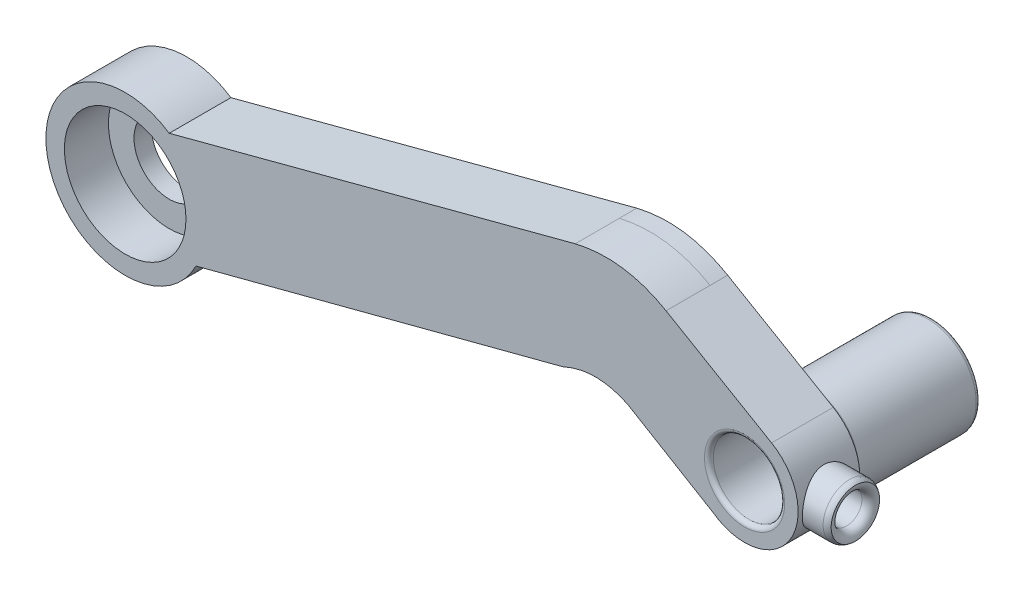
ISO-10303-21;
HEADER;
FILE_DESCRIPTION(('STEP AP214'),'2;1');
FILE_NAME('part.step','',(''),(''),'','','');
FILE_SCHEMA(('AUTOMOTIVE_DESIGN { 1 0 10303 214 1 1 1 1 }'));
ENDSEC;
DATA;
#1=APPLICATION_CONTEXT('core data for automotive mechanical design processes');
#2=APPLICATION_PROTOCOL_DEFINITION('international standard','automotive_design',2000,#1);
#3=PRODUCT_CONTEXT('',#1,'mechanical');
#4=PRODUCT('Part','Part','',(#3));
#5=PRODUCT_RELATED_PRODUCT_CATEGORY('part','',(#4));
#6=PRODUCT_DEFINITION_FORMATION('','',#4);
#7=PRODUCT_DEFINITION_CONTEXT('part definition',#1,'design');
#8=PRODUCT_DEFINITION('design','',#6,#7);
#9=PRODUCT_DEFINITION_SHAPE('','',#8);
#10=(LENGTH_UNIT() NAMED_UNIT(*) SI_UNIT(.MILLI.,.METRE.));
#11=(NAMED_UNIT(*) PLANE_ANGLE_UNIT() SI_UNIT($,.RADIAN.));
#12=(NAMED_UNIT(*) SI_UNIT($,.STERADIAN.) SOLID_ANGLE_UNIT());
#13=UNCERTAINTY_MEASURE_WITH_UNIT(LENGTH_MEASURE(1.E-05),#10,'distance_accuracy_value','');
#14=(GEOMETRIC_REPRESENTATION_CONTEXT(3) GLOBAL_UNCERTAINTY_ASSIGNED_CONTEXT((#13)) GLOBAL_UNIT_ASSIGNED_CONTEXT((#10,
#11,#12)) REPRESENTATION_CONTEXT('',''));
#15=CARTESIAN_POINT('',(0.,0.,0.));
#16=DIRECTION('',(0.,0.,1.));
#17=DIRECTION('',(1.,0.,0.));
#18=AXIS2_PLACEMENT_3D('',#15,#16,#17);
#19=CARTESIAN_POINT('',(-107.093850029804,47.3443372267548,107.431586296032));
#20=DIRECTION('',(0.,0.,1.));
#21=DIRECTION('',(1.,0.,0.));
#22=AXIS2_PLACEMENT_3D('',#19,#20,#21);
#23=PLANE('',#22);
#24=CARTESIAN_POINT('',(-107.093850029804,47.3443372267548,107.431586296032));
#25=DIRECTION('',(0.,0.,1.));
#26=DIRECTION('',(1.,0.,0.));
#27=AXIS2_PLACEMENT_3D('',#24,#25,#26);
#28=CIRCLE('',#27,4.55);
#29=CARTESIAN_POINT('',(-102.543850029804,47.3443372267548,107.431586296032));
#30=VERTEX_POINT('',#29);
#31=EDGE_CURVE('E226',#30,#30,#28,.F.);
#32=ORIENTED_EDGE('',*,*,#31,.T.);
#33=EDGE_LOOP('',(#32));
#34=FACE_BOUND('',#33,.T.);
#35=CARTESIAN_POINT('',(-107.093850029804,47.3443372267548,107.431586296032));
#36=DIRECTION('',(0.,0.,1.));
#37=DIRECTION('',(1.,0.,0.));
#38=AXIS2_PLACEMENT_3D('',#35,#36,#37);
#39=CIRCLE('',#38,6.07839242349853);
#40=CARTESIAN_POINT('',(-110.668111788424,42.4278845080859,107.431586296032));
#41=VERTEX_POINT('',#40);
#42=CARTESIAN_POINT('',(-104.027789288731,52.5927775651886,107.431586296032));
#43=VERTEX_POINT('',#42);
#44=EDGE_CURVE('E323',#41,#43,#39,.T.);
#45=ORIENTED_EDGE('',*,*,#44,.T.);
#46=DIRECTION('',(-0.863458620760315,0.504419676692627,0.));
#47=VECTOR('',#46,1.);
#48=CARTESIAN_POINT('',(-104.027789288731,52.5927775651886,107.431586296032));
#49=LINE('',#48,#47);
#50=CARTESIAN_POINT('',(-116.009751369964,59.5924615036388,107.431586296032));
#51=VERTEX_POINT('',#50);
#52=EDGE_CURVE('E179',#43,#51,#49,.T.);
#53=ORIENTED_EDGE('',*,*,#52,.T.);
#54=CARTESIAN_POINT('',(-186600.66213236,-982410.656727902,107.431586296032));
#55=CARTESIAN_POINT('',(191356.922105133,981558.279573141,107.431586296032));
#56=CARTESIAN_POINT('',(-196594.256959693,-980461.037584645,107.431586296032));
#57=B_SPLINE_CURVE_WITH_KNOTS('',2,(#54,#55,#56),.UNSPECIFIED.,.F.,.F.,(3,3),(0.,1.),.UNSPECIFIED.);
#58=CARTESIAN_POINT('',(-126.318658242328,61.0272416894636,107.431586296032));
#59=VERTEX_POINT('',#58);
#60=EDGE_CURVE('E172',#51,#59,#57,.T.);
#61=ORIENTED_EDGE('',*,*,#60,.T.);
#62=DIRECTION('',(-0.966805766449427,-0.255512445802817,0.));
#63=VECTOR('',#62,1.);
#64=CARTESIAN_POINT('',(-126.318658242328,61.0272416894636,107.431586296032));
#65=LINE('',#64,#63);
#66=CARTESIAN_POINT('',(-172.40389810036,48.8475953114948,107.431586296032));
#67=VERTEX_POINT('',#66);
#68=EDGE_CURVE('E178',#59,#67,#65,.T.);
#69=ORIENTED_EDGE('',*,*,#68,.T.);
#70=CARTESIAN_POINT('',(-177.403833472149,41.3642373568112,107.431586296032));
#71=DIRECTION('',(0.,0.,1.));
#72=DIRECTION('',(1.,0.,0.));
#73=AXIS2_PLACEMENT_3D('',#70,#71,#72);
#74=CIRCLE('',#73,9.00000000000001);
#75=CARTESIAN_POINT('',(-169.366561173002,37.3142677286101,107.431586296032));
#76=VERTEX_POINT('',#75);
#77=EDGE_CURVE('E119',#67,#76,#74,.T.);
#78=ORIENTED_EDGE('',*,*,#77,.T.);
#79=DIRECTION('',(0.967307706535536,0.253605601036256,0.));
#80=VECTOR('',#79,1.);
#81=CARTESIAN_POINT('',(-169.366561173002,37.3142677286101,107.431586296032));
#82=LINE('',#81,#80);
#83=CARTESIAN_POINT('',(-127.716130964861,48.2340425993882,107.431586296032));
#84=VERTEX_POINT('',#83);
#85=EDGE_CURVE('E112',#76,#84,#82,.T.);
#86=ORIENTED_EDGE('',*,*,#85,.T.);
#87=CARTESIAN_POINT('',(-51611.1375174065,-998632.270096202,107.431586296032));
#88=CARTESIAN_POINT('',(47443.000953233,998917.149880823,107.431586296032));
#89=CARTESIAN_POINT('',(-43769.520931614,-999005.692335592,107.431586296032));
#90=B_SPLINE_CURVE_WITH_KNOTS('',2,(#87,#88,#89),.UNSPECIFIED.,.F.,.F.,(3,3),(0.,1.),.UNSPECIFIED.);
#91=CARTESIAN_POINT('',(-120.222972715373,48.1324174911713,107.431586296032));
#92=VERTEX_POINT('',#91);
#93=EDGE_CURVE('E116',#84,#92,#90,.T.);
#94=ORIENTED_EDGE('',*,*,#93,.T.);
#95=DIRECTION('',(0.85861613792559,-0.512619086353352,0.));
#96=VECTOR('',#95,1.);
#97=CARTESIAN_POINT('',(-120.222972715373,48.1324174911713,107.431586296032));
#98=LINE('',#97,#96);
#99=EDGE_CURVE('E60',#92,#41,#98,.T.);
#100=ORIENTED_EDGE('',*,*,#99,.T.);
#101=EDGE_LOOP('',(#45,#53,#61,#69,#78,#86,#94,#100));
#102=FACE_BOUND('',#101,.T.);
#103=CARTESIAN_POINT('',(-177.403833472149,41.3642373568112,107.431586296032));
#104=DIRECTION('',(0.,0.,1.));
#105=DIRECTION('',(1.,0.,0.));
#106=AXIS2_PLACEMENT_3D('',#103,#104,#105);
#107=CIRCLE('',#106,6.89999999999999);
#108=CARTESIAN_POINT('',(-170.503833472149,41.3642373568112,107.431586296032));
#109=VERTEX_POINT('',#108);
#110=EDGE_CURVE('E318',#109,#109,#107,.T.);
#111=ORIENTED_EDGE('',*,*,#110,.F.);
#112=EDGE_LOOP('',(#111));
#113=FACE_BOUND('',#112,.T.);
#114=ADVANCED_FACE('F37',(#34,#102,#113),#23,.T.);
#115=CARTESIAN_POINT('',(-107.093850029804,47.3443372267548,107.431586296032));
#116=DIRECTION('',(0.,0.,-1.));
#117=DIRECTION('',(-1.,0.,0.));
#118=AXIS2_PLACEMENT_3D('',#115,#116,#117);
#119=CYLINDRICAL_SURFACE('',#118,6.07839242349853);
#120=DIRECTION('',(0.,0.,-1.));
#121=VECTOR('',#120,1.);
#122=CARTESIAN_POINT('',(-102.015457606305,44.0041598591593,107.431586296032));
#123=LINE('',#122,#121);
#124=CARTESIAN_POINT('',(-102.015457606305,44.0041598591593,104.597316878061));
#125=VERTEX_POINT('',#124);
#126=CARTESIAN_POINT('',(-102.015457606305,44.0041598591593,103.265855714003));
#127=VERTEX_POINT('',#126);
#128=EDGE_CURVE('E51',#125,#127,#123,.T.);
#129=ORIENTED_EDGE('',*,*,#128,.F.);
#130=CARTESIAN_POINT('',(-101.029639500958,46.9293611842224,100.931586296032));
#131=CARTESIAN_POINT('',(-101.03514837896,46.8488701778565,100.931587324956));
#132=CARTESIAN_POINT('',(-101.042264854202,46.7684737406602,100.934832002595));
#133=CARTESIAN_POINT('',(-101.059620476645,46.608522329393,100.947710205555));
#134=CARTESIAN_POINT('',(-101.069861257932,46.5289678182523,100.957347077248));
#135=CARTESIAN_POINT('',(-101.105090300508,46.2922047582818,100.995678467459));
#136=CARTESIAN_POINT('',(-101.134572872195,46.137072358686,101.033793251388));
#137=CARTESIAN_POINT('',(-101.20316762867,45.8375873693566,101.132862169356));
#138=CARTESIAN_POINT('',(-101.242233928288,45.6931875651807,101.193708175694));
#139=CARTESIAN_POINT('',(-101.327237934188,45.417192408938,101.335927683262));
#140=CARTESIAN_POINT('',(-101.373174299552,45.2855945664047,101.417297180784));
#141=CARTESIAN_POINT('',(-101.472329844249,45.0279101321683,101.605259135258));
#142=CARTESIAN_POINT('',(-101.525836933274,44.9029831338531,101.713288701504));
#143=CARTESIAN_POINT('',(-101.632765596097,44.6723337571731,101.948403481326));
#144=CARTESIAN_POINT('',(-101.68618702545,44.5666312520293,102.07550816883));
#145=CARTESIAN_POINT('',(-101.791806527694,44.3696813095953,102.356918361616));
#146=CARTESIAN_POINT('',(-101.843625678606,44.2800687037756,102.512536859455));
#147=CARTESIAN_POINT('',(-101.911885626921,44.1669091070401,102.758127384239));
#148=CARTESIAN_POINT('',(-101.933062659212,44.1327298166241,102.842028125237));
#149=CARTESIAN_POINT('',(-101.971423698425,44.0718923714042,103.013371777219));
#150=CARTESIAN_POINT('',(-101.988610573199,44.0452288118357,103.100812090785));
#151=CARTESIAN_POINT('',(-102.016764665662,44.0020839033364,103.269846790908));
#152=CARTESIAN_POINT('',(-102.028175121763,43.9848629039182,103.351179125895));
#153=CARTESIAN_POINT('',(-102.046630531779,43.9571987287439,103.515436522181));
#154=CARTESIAN_POINT('',(-102.053678104976,43.9467514861457,103.598360596978));
#155=CARTESIAN_POINT('',(-102.0630936411,43.9328245898158,103.765002408627));
#156=CARTESIAN_POINT('',(-102.065465047672,43.9293398087286,103.848719515783));
#157=CARTESIAN_POINT('',(-102.065437533752,43.9293827921386,104.016122378401));
#158=CARTESIAN_POINT('',(-102.063039146919,43.9329097721389,104.099808136322));
#159=CARTESIAN_POINT('',(-102.050239138091,43.9518304130028,104.324518213254));
#160=CARTESIAN_POINT('',(-102.035420778553,43.973787141592,104.464805801786));
#161=CARTESIAN_POINT('',(-101.994091342886,44.0366663211081,104.739169108793));
#162=CARTESIAN_POINT('',(-101.967575475145,44.0775965444367,104.87324225677));
#163=CARTESIAN_POINT('',(-101.904449297202,44.1787948298536,105.137934016518));
#164=CARTESIAN_POINT('',(-101.867469158891,44.2397880074058,105.268184649224));
#165=CARTESIAN_POINT('',(-101.787425470533,44.3786782468137,105.517267170542));
#166=CARTESIAN_POINT('',(-101.7443591196,44.4565831003483,105.636093759246));
#167=CARTESIAN_POINT('',(-101.648138544164,44.6418080855962,105.879445549291));
#168=CARTESIAN_POINT('',(-101.594488704865,44.7518574551588,106.001705378748));
#169=CARTESIAN_POINT('',(-101.488105785973,44.9907025462812,106.226923362917));
#170=CARTESIAN_POINT('',(-101.435373373809,45.119511325256,106.329867958183));
#171=CARTESIAN_POINT('',(-101.331271078114,45.4041872145856,106.521066639427));
#172=CARTESIAN_POINT('',(-101.280309820244,45.5613671498089,106.607608050246));
#173=CARTESIAN_POINT('',(-101.189216115857,45.8912892022293,106.752003973535));
#174=CARTESIAN_POINT('',(-101.14907537686,46.064019266123,106.809880482471));
#175=CARTESIAN_POINT('',(-101.086113647202,46.4053963749256,106.890247224182));
#176=CARTESIAN_POINT('',(-101.06215525563,46.573245570073,106.915218884505));
#177=CARTESIAN_POINT('',(-101.028459093046,46.9121270884989,106.936326613966));
#178=CARTESIAN_POINT('',(-101.018711666662,47.0831571704956,106.932482272508));
#179=CARTESIAN_POINT('',(-101.013837418185,47.4055560328334,106.89754736327));
#180=CARTESIAN_POINT('',(-101.017370268294,47.5572078219119,106.869166320528));
#181=CARTESIAN_POINT('',(-101.035022805788,47.8537838656488,106.789734005047));
#182=CARTESIAN_POINT('',(-101.049142822067,47.9987079111593,106.73868202805));
#183=CARTESIAN_POINT('',(-101.086054928131,48.278867648582,106.615314732286));
#184=CARTESIAN_POINT('',(-101.10889190893,48.4140488084345,106.542889791629));
#185=CARTESIAN_POINT('',(-101.160561971437,48.6710450253328,106.378990855084));
#186=CARTESIAN_POINT('',(-101.189397182707,48.7928553117657,106.287510093758));
#187=CARTESIAN_POINT('',(-101.252548720017,49.0302684226731,106.079402894734));
#188=CARTESIAN_POINT('',(-101.287120905531,49.1445326975329,105.961325588729));
#189=CARTESIAN_POINT('',(-101.355694299152,49.3524289752452,105.707991531997));
#190=CARTESIAN_POINT('',(-101.389695207125,49.4460504278885,105.572726052085));
#191=CARTESIAN_POINT('',(-101.454510225301,49.6144164128436,105.280750651648));
#192=CARTESIAN_POINT('',(-101.485083401786,49.6879976720877,105.12331081739));
#193=CARTESIAN_POINT('',(-101.536369083653,49.8071654000785,104.796688522582));
#194=CARTESIAN_POINT('',(-101.557089185172,49.8527734424065,104.627515223516));
#195=CARTESIAN_POINT('',(-101.584290560656,49.9119455649083,104.293639846149));
#196=CARTESIAN_POINT('',(-101.591590735547,49.927356652712,104.129333483464));
#197=CARTESIAN_POINT('',(-101.593298888728,49.930996739837,103.800379229532));
#198=CARTESIAN_POINT('',(-101.587711000933,49.919234455161,103.635731464717));
#199=CARTESIAN_POINT('',(-101.565356556279,49.8708430588426,103.322376258889));
#200=CARTESIAN_POINT('',(-101.549365256595,49.8359354910232,103.173340538804));
#201=CARTESIAN_POINT('',(-101.509119903712,49.7443637991683,102.883300144777));
#202=CARTESIAN_POINT('',(-101.484863464174,49.6876933910933,102.742297803997));
#203=CARTESIAN_POINT('',(-101.42959948646,49.5508771610394,102.464317905793));
#204=CARTESIAN_POINT('',(-101.398309591107,49.4696767641473,102.327917292507));
#205=CARTESIAN_POINT('',(-101.333488663575,49.2871338275567,102.069893591578));
#206=CARTESIAN_POINT('',(-101.299956691679,49.1857828065968,101.948276761178));
#207=CARTESIAN_POINT('',(-101.231701857401,48.9560352407744,101.713079990934));
#208=CARTESIAN_POINT('',(-101.197102682948,48.826112604957,101.600949927174));
#209=CARTESIAN_POINT('',(-101.134098320088,48.5478640486654,101.39981716196));
#210=CARTESIAN_POINT('',(-101.105694792129,48.3995332114204,101.310820659133));
#211=CARTESIAN_POINT('',(-101.071018808127,48.1679529046836,101.197887263987));
#212=CARTESIAN_POINT('',(-101.060843232217,48.0900419120073,101.163902800728));
#213=CARTESIAN_POINT('',(-101.043343867949,47.9313487127396,101.102586306718));
#214=CARTESIAN_POINT('',(-101.036018686361,47.8505679299847,101.075251028398));
#215=CARTESIAN_POINT('',(-101.024567098357,47.686939362868,101.027567304449));
#216=CARTESIAN_POINT('',(-101.020433960593,47.6040963105819,101.00720420675));
#217=CARTESIAN_POINT('',(-101.015588218602,47.436916781823,100.973605879329));
#218=CARTESIAN_POINT('',(-101.014873553637,47.3525812358486,100.960366359616));
#219=CARTESIAN_POINT('',(-101.01664556465,47.2116411499363,100.94435947308));
#220=CARTESIAN_POINT('',(-101.018136885435,47.1552442607092,100.939567927675));
#221=CARTESIAN_POINT('',(-101.022701655192,47.042336459454,100.933181055204));
#222=CARTESIAN_POINT('',(-101.025775027976,46.9858255530471,100.931585574242));
#223=CARTESIAN_POINT('',(-101.029639500958,46.9293611842224,100.931586296032));
#224=B_SPLINE_CURVE_WITH_KNOTS('',3,(#130,#131,#132,#133,#134,#135,#136,#137,#138,#139,#140,
#141,#142,#143,#144,#145,#146,#147,#148,#149,#150,#151,#152,#153,#154,#155,#156,#157,#158,#159,
#160,#161,#162,#163,#164,#165,#166,#167,#168,#169,#170,#171,#172,#173,#174,#175,#176,#177,#178,
#179,#180,#181,#182,#183,#184,#185,#186,#187,#188,#189,#190,#191,#192,#193,#194,#195,#196,#197,
#198,#199,#200,#201,#202,#203,#204,#205,#206,#207,#208,#209,#210,#211,#212,#213,#214,#215,#216,
#217,#218,#219,#220,#221,#222,#223),.UNSPECIFIED.,.T.,.F.,(4,2,2,2,2,2,2,2,2,2,2,2,2,2,2,2,2,2,
2,2,2,2,2,2,2,2,2,2,2,2,2,2,2,2,2,2,2,2,2,2,2,2,2,2,2,2,4),(0.,0.241976151992528,
0.484079080770245,0.968805991864989,1.45125592348759,1.93361181184639,2.45225908842233,
2.97143950377482,3.52880308968135,3.80754748181999,4.08609090695529,4.33745647265872,
4.58867098289715,4.83970042330999,5.0907017793762,5.51684725497591,5.94316745351604,
6.38699526891318,6.83102800375372,7.34793525150434,7.86520402552325,8.42181230521929,
8.97799279843693,9.48923238397878,10.0001244553084,10.4609039663731,10.9216977922767,
11.3848973694326,11.8482616786934,12.3498070684413,12.8516081987275,13.3782390269967,
13.9044631932075,14.397349899487,14.8900785317039,15.3497446794628,15.809543656152,
16.2929153552599,16.7764909345854,17.2992528678341,17.8221547308242,18.0786855237172,
18.3350907701147,18.590953824079,18.8466626181231,19.0164168460133,19.186162899762),.UNSPECIFIED.);
#225=EDGE_CURVE('E242',#125,#127,#224,.T.);
#226=ORIENTED_EDGE('',*,*,#225,.T.);
#227=EDGE_LOOP('',(#129,#226));
#228=FACE_BOUND('',#227,.T.);
#229=DIRECTION('',(0.,0.,-1.));
#230=VECTOR('',#229,1.);
#231=CARTESIAN_POINT('',(-110.668111788424,42.4278845080859,107.431586296032));
#232=LINE('',#231,#230);
#233=CARTESIAN_POINT('',(-110.668111788424,42.4278845080859,100.431586296032));
#234=VERTEX_POINT('',#233);
#235=EDGE_CURVE('E139',#41,#234,#232,.T.);
#236=ORIENTED_EDGE('',*,*,#235,.T.);
#237=CARTESIAN_POINT('',(-107.093850029804,47.3443372267548,100.431586296032));
#238=DIRECTION('',(0.,0.,-1.));
#239=DIRECTION('',(-1.,0.,0.));
#240=AXIS2_PLACEMENT_3D('',#237,#238,#239);
#241=CIRCLE('',#240,6.07839242349853);
#242=CARTESIAN_POINT('',(-104.027789288731,52.5927775651886,100.431586296032));
#243=VERTEX_POINT('',#242);
#244=EDGE_CURVE('E347',#243,#234,#241,.T.);
#245=ORIENTED_EDGE('',*,*,#244,.F.);
#246=DIRECTION('',(0.,0.,-1.));
#247=VECTOR('',#246,1.);
#248=CARTESIAN_POINT('',(-104.027789288731,52.5927775651886,107.431586296032));
#249=LINE('',#248,#247);
#250=EDGE_CURVE('E82',#43,#243,#249,.T.);
#251=ORIENTED_EDGE('',*,*,#250,.F.);
#252=ORIENTED_EDGE('',*,*,#44,.F.);
#253=EDGE_LOOP('',(#236,#245,#251,#252));
#254=FACE_BOUND('',#253,.T.);
#255=ADVANCED_FACE('F249',(#228,#254),#119,.T.);
#256=CARTESIAN_POINT('',(-104.027789288731,52.5927775651886,107.431586296032));
#257=DIRECTION('',(-0.504419676692627,-0.863458620760315,0.));
#258=DIRECTION('',(0.863458620760315,-0.504419676692627,0.));
#259=AXIS2_PLACEMENT_3D('',#256,#257,#258);
#260=PLANE('',#259);
#261=ORIENTED_EDGE('',*,*,#250,.T.);
#262=DIRECTION('',(0.863458620758999,-0.504419676694879,0.));
#263=VECTOR('',#262,1.);
#264=CARTESIAN_POINT('',(-116.009751369881,59.5924615035235,100.431586296032));
#265=LINE('',#264,#263);
#266=CARTESIAN_POINT('',(-116.009751369881,59.5924615035235,100.431586296032));
#267=VERTEX_POINT('',#266);
#268=EDGE_CURVE('E305',#267,#243,#265,.T.);
#269=ORIENTED_EDGE('',*,*,#268,.F.);
#270=DIRECTION('',(0.,0.,1.));
#271=VECTOR('',#270,1.);
#272=CARTESIAN_POINT('',(-116.009751369881,59.5924615035235,100.431586296032));
#273=LINE('',#272,#271);
#274=CARTESIAN_POINT('',(-116.009751369964,59.5924615036388,102.431586296032));
#275=VERTEX_POINT('',#274);
#276=EDGE_CURVE('E73',#267,#275,#273,.T.);
#277=ORIENTED_EDGE('',*,*,#276,.T.);
#278=DIRECTION('',(0.,0.,-1.));
#279=VECTOR('',#278,1.);
#280=CARTESIAN_POINT('',(-116.009751369964,59.5924615036388,107.431586296032));
#281=LINE('',#280,#279);
#282=EDGE_CURVE('E207',#51,#275,#281,.T.);
#283=ORIENTED_EDGE('',*,*,#282,.F.);
#284=ORIENTED_EDGE('',*,*,#52,.F.);
#285=EDGE_LOOP('',(#261,#269,#277,#283,#284));
#286=FACE_BOUND('',#285,.T.);
#287=ADVANCED_FACE('F169',(#286),#260,.F.);
#288=DIRECTION('',(0.,0.,-1.));
#289=VECTOR('',#288,1.);
#290=SURFACE_OF_LINEAR_EXTRUSION('',#57,#289);
#291=CARTESIAN_POINT('',(-186600.66213236,-982410.656727902,102.431586296032));
#292=CARTESIAN_POINT('',(191356.922105133,981558.279573141,102.431586296032));
#293=CARTESIAN_POINT('',(-196594.256959693,-980461.037584645,102.431586296032));
#294=B_SPLINE_CURVE_WITH_KNOTS('',2,(#291,#292,#293),.UNSPECIFIED.,.F.,.F.,(3,3),(0.,1.),.UNSPECIFIED.);
#295=CARTESIAN_POINT('',(-126.318658237721,61.0272416906097,102.431586296032));
#296=VERTEX_POINT('',#295);
#297=EDGE_CURVE('E321',#275,#296,#294,.T.);
#298=ORIENTED_EDGE('',*,*,#297,.T.);
#299=DIRECTION('',(0.,0.,-1.));
#300=VECTOR('',#299,1.);
#301=CARTESIAN_POINT('',(-126.318658242328,61.0272416894636,107.431586296032));
#302=LINE('',#301,#300);
#303=EDGE_CURVE('E198',#59,#296,#302,.T.);
#304=ORIENTED_EDGE('',*,*,#303,.F.);
#305=ORIENTED_EDGE('',*,*,#60,.F.);
#306=ORIENTED_EDGE('',*,*,#282,.T.);
#307=EDGE_LOOP('',(#298,#304,#305,#306));
#308=FACE_BOUND('',#307,.T.);
#309=ADVANCED_FACE('F164',(#308),#290,.F.);
#310=CARTESIAN_POINT('',(-126.318658242328,61.0272416894636,107.431586296032));
#311=DIRECTION('',(0.255512445802817,-0.966805766449427,0.));
#312=DIRECTION('',(0.966805766449427,0.255512445802817,0.));
#313=AXIS2_PLACEMENT_3D('',#310,#311,#312);
#314=PLANE('',#313);
#315=ORIENTED_EDGE('',*,*,#303,.T.);
#316=DIRECTION('',(0.,0.,1.));
#317=VECTOR('',#316,1.);
#318=CARTESIAN_POINT('',(-126.318658237721,61.0272416906097,100.431586296032));
#319=LINE('',#318,#317);
#320=CARTESIAN_POINT('',(-126.318658237721,61.0272416906097,100.431586296032));
#321=VERTEX_POINT('',#320);
#322=EDGE_CURVE('E312',#321,#296,#319,.T.);
#323=ORIENTED_EDGE('',*,*,#322,.F.);
#324=DIRECTION('',(0.966805766449426,0.255512445802817,0.));
#325=VECTOR('',#324,1.);
#326=CARTESIAN_POINT('',(-172.40389810036,48.8475953114948,100.431586296032));
#327=LINE('',#326,#325);
#328=CARTESIAN_POINT('',(-172.40389810036,48.8475953114948,100.431586296032));
#329=VERTEX_POINT('',#328);
#330=EDGE_CURVE('E195',#329,#321,#327,.T.);
#331=ORIENTED_EDGE('',*,*,#330,.F.);
#332=DIRECTION('',(0.,0.,-1.));
#333=VECTOR('',#332,1.);
#334=CARTESIAN_POINT('',(-172.40389810036,48.8475953114948,107.431586296032));
#335=LINE('',#334,#333);
#336=EDGE_CURVE('E191',#67,#329,#335,.T.);
#337=ORIENTED_EDGE('',*,*,#336,.F.);
#338=ORIENTED_EDGE('',*,*,#68,.F.);
#339=EDGE_LOOP('',(#315,#323,#331,#337,#338));
#340=FACE_BOUND('',#339,.T.);
#341=ADVANCED_FACE('F160',(#340),#314,.F.);
#342=CARTESIAN_POINT('',(-177.403833472149,41.3642373568112,107.431586296032));
#343=DIRECTION('',(0.,0.,-1.));
#344=DIRECTION('',(-1.,0.,0.));
#345=AXIS2_PLACEMENT_3D('',#342,#343,#344);
#346=CYLINDRICAL_SURFACE('',#345,9.00000000000001);
#347=ORIENTED_EDGE('',*,*,#336,.T.);
#348=CARTESIAN_POINT('',(-177.403833472149,41.3642373568112,100.431586296032));
#349=DIRECTION('',(0.,0.,-1.));
#350=DIRECTION('',(-1.,0.,0.));
#351=AXIS2_PLACEMENT_3D('',#348,#349,#350);
#352=CIRCLE('',#351,9.);
#353=CARTESIAN_POINT('',(-169.366561173002,37.3142677286101,100.431586296032));
#354=VERTEX_POINT('',#353);
#355=EDGE_CURVE('E201',#354,#329,#352,.T.);
#356=ORIENTED_EDGE('',*,*,#355,.F.);
#357=DIRECTION('',(0.,0.,-1.));
#358=VECTOR('',#357,1.);
#359=CARTESIAN_POINT('',(-169.366561173002,37.3142677286101,107.431586296032));
#360=LINE('',#359,#358);
#361=EDGE_CURVE('E133',#76,#354,#360,.T.);
#362=ORIENTED_EDGE('',*,*,#361,.F.);
#363=ORIENTED_EDGE('',*,*,#77,.F.);
#364=EDGE_LOOP('',(#347,#356,#362,#363));
#365=FACE_BOUND('',#364,.T.);
#366=ADVANCED_FACE('F157',(#365),#346,.T.);
#367=CARTESIAN_POINT('',(-169.366561173002,37.3142677286101,107.431586296032));
#368=DIRECTION('',(-0.253605601036256,0.967307706535536,0.));
#369=DIRECTION('',(-0.967307706535536,-0.253605601036256,0.));
#370=AXIS2_PLACEMENT_3D('',#367,#368,#369);
#371=PLANE('',#370);
#372=ORIENTED_EDGE('',*,*,#361,.T.);
#373=DIRECTION('',(-0.967307706507298,-0.253605601143964,0.));
#374=VECTOR('',#373,1.);
#375=CARTESIAN_POINT('',(-127.716130938146,48.2340426115734,100.431586296032));
#376=LINE('',#375,#374);
#377=CARTESIAN_POINT('',(-127.716130938146,48.2340426115734,100.431586296032));
#378=VERTEX_POINT('',#377);
#379=EDGE_CURVE('E362',#378,#354,#376,.T.);
#380=ORIENTED_EDGE('',*,*,#379,.F.);
#381=DIRECTION('',(0.,0.,1.));
#382=VECTOR('',#381,1.);
#383=CARTESIAN_POINT('',(-127.716130938146,48.2340426115734,100.431586296032));
#384=LINE('',#383,#382);
#385=CARTESIAN_POINT('',(-127.716130938146,48.2340426115734,102.431586296032));
#386=VERTEX_POINT('',#385);
#387=EDGE_CURVE('E130',#378,#386,#384,.T.);
#388=ORIENTED_EDGE('',*,*,#387,.T.);
#389=DIRECTION('',(0.,0.,-1.));
#390=VECTOR('',#389,1.);
#391=CARTESIAN_POINT('',(-127.716130964861,48.2340425993882,107.431586296032));
#392=LINE('',#391,#390);
#393=EDGE_CURVE('E126',#84,#386,#392,.T.);
#394=ORIENTED_EDGE('',*,*,#393,.F.);
#395=ORIENTED_EDGE('',*,*,#85,.F.);
#396=EDGE_LOOP('',(#372,#380,#388,#394,#395));
#397=FACE_BOUND('',#396,.T.);
#398=ADVANCED_FACE('F127',(#397),#371,.F.);
#399=DIRECTION('',(0.,0.,-1.));
#400=VECTOR('',#399,1.);
#401=SURFACE_OF_LINEAR_EXTRUSION('',#90,#400);
#402=CARTESIAN_POINT('',(-51611.1375174065,-998632.270096202,102.431586296032));
#403=CARTESIAN_POINT('',(47443.000953233,998917.149880823,102.431586296032));
#404=CARTESIAN_POINT('',(-43769.520931614,-999005.692335592,102.431586296032));
#405=B_SPLINE_CURVE_WITH_KNOTS('',2,(#402,#403,#404),.UNSPECIFIED.,.F.,.F.,(3,3),(0.,1.),.UNSPECIFIED.);
#406=CARTESIAN_POINT('',(-120.222972708589,48.1324174876799,102.431586296032));
#407=VERTEX_POINT('',#406);
#408=EDGE_CURVE('E324',#386,#407,#405,.T.);
#409=ORIENTED_EDGE('',*,*,#408,.T.);
#410=DIRECTION('',(0.,0.,-1.));
#411=VECTOR('',#410,1.);
#412=CARTESIAN_POINT('',(-120.222972715373,48.1324174911713,107.431586296032));
#413=LINE('',#412,#411);
#414=EDGE_CURVE('E134',#92,#407,#413,.T.);
#415=ORIENTED_EDGE('',*,*,#414,.F.);
#416=ORIENTED_EDGE('',*,*,#93,.F.);
#417=ORIENTED_EDGE('',*,*,#393,.T.);
#418=EDGE_LOOP('',(#409,#415,#416,#417));
#419=FACE_BOUND('',#418,.T.);
#420=ADVANCED_FACE('F136',(#419),#401,.F.);
#421=CARTESIAN_POINT('',(-120.222972715373,48.1324174911713,107.431586296032));
#422=DIRECTION('',(0.512619086353352,0.85861613792559,0.));
#423=DIRECTION('',(-0.85861613792559,0.512619086353352,0.));
#424=AXIS2_PLACEMENT_3D('',#421,#422,#423);
#425=PLANE('',#424);
#426=ORIENTED_EDGE('',*,*,#414,.T.);
#427=DIRECTION('',(0.,0.,1.));
#428=VECTOR('',#427,1.);
#429=CARTESIAN_POINT('',(-120.222972708589,48.1324174876799,100.431586296032));
#430=LINE('',#429,#428);
#431=CARTESIAN_POINT('',(-120.222972708589,48.1324174876799,100.431586296032));
#432=VERTEX_POINT('',#431);
#433=EDGE_CURVE('E315',#432,#407,#430,.T.);
#434=ORIENTED_EDGE('',*,*,#433,.F.);
#435=DIRECTION('',(-0.858616137925589,0.512619086353353,0.));
#436=VECTOR('',#435,1.);
#437=CARTESIAN_POINT('',(-110.668111788424,42.4278845080859,100.431586296032));
#438=LINE('',#437,#436);
#439=EDGE_CURVE('E343',#234,#432,#438,.T.);
#440=ORIENTED_EDGE('',*,*,#439,.F.);
#441=ORIENTED_EDGE('',*,*,#235,.F.);
#442=ORIENTED_EDGE('',*,*,#99,.F.);
#443=EDGE_LOOP('',(#426,#434,#440,#441,#442));
#444=FACE_BOUND('',#443,.T.);
#445=ADVANCED_FACE('F153',(#444),#425,.F.);
#446=CARTESIAN_POINT('',(-107.093850029804,47.3443372267548,107.431586296032));
#447=DIRECTION('',(0.,0.,-1.));
#448=DIRECTION('',(-1.,0.,0.));
#449=AXIS2_PLACEMENT_3D('',#446,#447,#448);
#450=CYLINDRICAL_SURFACE('',#449,4.05);
#451=CARTESIAN_POINT('',(-103.06516601587,46.9293611842224,102.181586296032));
#452=CARTESIAN_POINT('',(-103.075060000896,46.833385201861,102.181596397625));
#453=CARTESIAN_POINT('',(-103.088425255544,46.737607208956,102.189530322442));
#454=CARTESIAN_POINT('',(-103.121451807033,46.5495179045129,102.220632446272));
#455=CARTESIAN_POINT('',(-103.141131325367,46.457217500611,102.243844942051));
#456=CARTESIAN_POINT('',(-103.185388680086,46.2790614079683,102.30419252342));
#457=CARTESIAN_POINT('',(-103.209943504901,46.1931779573536,102.341262898907));
#458=CARTESIAN_POINT('',(-103.262353759853,46.0292119002682,102.427977582026));
#459=CARTESIAN_POINT('',(-103.290208046734,45.9511266089416,102.477617541075));
#460=CARTESIAN_POINT('',(-103.349339302732,45.7989392980635,102.592061085546));
#461=CARTESIAN_POINT('',(-103.380719714251,45.7254876295163,102.657676726633));
#462=CARTESIAN_POINT('',(-103.442605732052,45.5903561757495,102.800549166119));
#463=CARTESIAN_POINT('',(-103.473110574908,45.5286864134097,102.877815776923));
#464=CARTESIAN_POINT('',(-103.531685723101,45.4162063067227,103.046383772149));
#465=CARTESIAN_POINT('',(-103.55958331292,45.366013915248,103.138162146698));
#466=CARTESIAN_POINT('',(-103.607725274785,45.282350709972,103.330878724293));
#467=CARTESIAN_POINT('',(-103.627980287816,45.248856625577,103.431803947113));
#468=CARTESIAN_POINT('',(-103.65604962178,45.203151052788,103.628609320317));
#469=CARTESIAN_POINT('',(-103.664953278484,45.1890630686814,103.723893842979));
#470=CARTESIAN_POINT('',(-103.672689856065,45.1767974746488,103.915859181916));
#471=CARTESIAN_POINT('',(-103.671531086383,45.1786067369648,104.012538780291));
#472=CARTESIAN_POINT('',(-103.660127196025,45.1967511983491,104.191675705467));
#473=CARTESIAN_POINT('',(-103.651031951744,45.2112488127667,104.274404448435));
#474=CARTESIAN_POINT('',(-103.626373273105,45.2515736202893,104.436036477937));
#475=CARTESIAN_POINT('',(-103.610807831078,45.2774043301313,104.51493856859));
#476=CARTESIAN_POINT('',(-103.573923328844,45.3408366649547,104.670843326376));
#477=CARTESIAN_POINT('',(-103.552372004127,45.3789262563986,104.747590528664));
#478=CARTESIAN_POINT('',(-103.505809408357,45.4652763401189,104.893971939722));
#479=CARTESIAN_POINT('',(-103.480796487256,45.5135416886741,104.963602728611));
#480=CARTESIAN_POINT('',(-103.425402715228,45.6269197117785,105.104384195893));
#481=CARTESIAN_POINT('',(-103.394769640547,45.6934608151147,105.174289002026));
#482=CARTESIAN_POINT('',(-103.333900010131,45.8372292545269,105.30236127743));
#483=CARTESIAN_POINT('',(-103.303663697996,45.9144628475392,105.360521824948));
#484=CARTESIAN_POINT('',(-103.243892183749,46.0838156782771,105.467240318717));
#485=CARTESIAN_POINT('',(-103.214545748655,46.176591168556,105.514871704494));
#486=CARTESIAN_POINT('',(-103.161392586391,46.3705000419401,105.593239057506));
#487=CARTESIAN_POINT('',(-103.137582610018,46.4716284754497,105.623984948902));
#488=CARTESIAN_POINT('',(-103.098781513035,46.6722785914793,105.665423075762));
#489=CARTESIAN_POINT('',(-103.083307933546,46.7714571785988,105.677316583271));
#490=CARTESIAN_POINT('',(-103.059820021056,46.9712470477762,105.683932595972));
#491=CARTESIAN_POINT('',(-103.0518012783,47.0718574470652,105.678665260624));
#492=CARTESIAN_POINT('',(-103.043652215459,47.2623954086759,105.652063129381));
#493=CARTESIAN_POINT('',(-103.04290376026,47.3524985574039,105.632146582756));
#494=CARTESIAN_POINT('',(-103.04707577603,47.5283277319699,105.578458394707));
#495=CARTESIAN_POINT('',(-103.051996257455,47.6140537497329,105.544686727724));
#496=CARTESIAN_POINT('',(-103.066363818616,47.7787174401787,105.464387041297));
#497=CARTESIAN_POINT('',(-103.075804746055,47.8576641677121,105.417876396229));
#498=CARTESIAN_POINT('',(-103.097729175016,48.0070804833983,105.313374752078));
#499=CARTESIAN_POINT('',(-103.110213586337,48.0775475272654,105.255380321084));
#500=CARTESIAN_POINT('',(-103.137351062643,48.2124596366466,105.125506344674));
#501=CARTESIAN_POINT('',(-103.152089520721,48.2762849640318,105.053000215607));
#502=CARTESIAN_POINT('',(-103.181043351678,48.3912210402981,104.898409548905));
#503=CARTESIAN_POINT('',(-103.19525858798,48.4423284891877,104.816322533355));
#504=CARTESIAN_POINT('',(-103.221570027927,48.5318567866331,104.641810777708));
#505=CARTESIAN_POINT('',(-103.233585705177,48.5698290279366,104.549142413844));
#506=CARTESIAN_POINT('',(-103.253032538144,48.6294905312969,104.358257364552));
#507=CARTESIAN_POINT('',(-103.260465674564,48.6511868291573,104.260043096286));
#508=CARTESIAN_POINT('',(-103.269330140697,48.6769009687988,104.065212565834));
#509=CARTESIAN_POINT('',(-103.270997552566,48.6816145365796,103.968698903467));
#510=CARTESIAN_POINT('',(-103.268728972522,48.6751117933448,103.776286184741));
#511=CARTESIAN_POINT('',(-103.264793694734,48.6638975125096,103.680387051617));
#512=CARTESIAN_POINT('',(-103.252150185387,48.6266033717303,103.495104433136));
#513=CARTESIAN_POINT('',(-103.243599302971,48.601012507656,103.405610605054));
#514=CARTESIAN_POINT('',(-103.223039821252,48.5361753792065,103.232138041228));
#515=CARTESIAN_POINT('',(-103.211030351184,48.4969256754376,103.148160700914));
#516=CARTESIAN_POINT('',(-103.18464181636,48.404056217139,102.984500357986));
#517=CARTESIAN_POINT('',(-103.170188244594,48.3499328908296,102.905115293881));
#518=CARTESIAN_POINT('',(-103.141267481667,48.2294491550126,102.756237387114));
#519=CARTESIAN_POINT('',(-103.126800288501,48.1630865115281,102.686746354466));
#520=CARTESIAN_POINT('',(-103.099377386541,48.0169524677041,102.556979385341));
#521=CARTESIAN_POINT('',(-103.08649853676,47.9367721014224,102.49714581356));
#522=CARTESIAN_POINT('',(-103.065048640461,47.7669131120698,102.391785346426));
#523=CARTESIAN_POINT('',(-103.056478563387,47.6772323569687,102.346261671562));
#524=CARTESIAN_POINT('',(-103.045634476962,47.4944467391515,102.272506935571));
#525=CARTESIAN_POINT('',(-103.043144042948,47.4015828920825,102.243710185073));
#526=CARTESIAN_POINT('',(-103.044898601592,47.2125927550954,102.201964700174));
#527=CARTESIAN_POINT('',(-103.04912440174,47.1164765268892,102.188970993689));
#528=CARTESIAN_POINT('',(-103.059259283395,46.9900417170233,102.182371255469));
#529=CARTESIAN_POINT('',(-103.062039313573,46.9596915641214,102.181583103721));
#530=CARTESIAN_POINT('',(-103.06516601587,46.9293611842224,102.181586296032));
#531=B_SPLINE_CURVE_WITH_KNOTS('',3,(#451,#452,#453,#454,#455,#456,#457,#458,#459,#460,#461,
#462,#463,#464,#465,#466,#467,#468,#469,#470,#471,#472,#473,#474,#475,#476,#477,#478,#479,#480,
#481,#482,#483,#484,#485,#486,#487,#488,#489,#490,#491,#492,#493,#494,#495,#496,#497,#498,#499,
#500,#501,#502,#503,#504,#505,#506,#507,#508,#509,#510,#511,#512,#513,#514,#515,#516,#517,#518,
#519,#520,#521,#522,#523,#524,#525,#526,#527,#528,#529,#530),.UNSPECIFIED.,.T.,.F.,(4,2,2,2,2,2,
2,2,2,2,2,2,2,2,2,2,2,2,2,2,2,2,2,2,2,2,2,2,2,2,2,2,2,2,2,2,2,2,2,4),(0.,0.289367616406886,
0.579577906348445,0.868449636056355,1.15722156370922,1.46599185550348,1.77502366015392,
2.09804463320174,2.42061418025226,2.70906228205944,2.99727220923774,3.24957957278893,
3.50196528447339,3.76599197096975,4.03014494795871,4.33263218845503,4.63529718986813,
4.95862369244483,5.2817599614911,5.58333335245215,5.88472824016857,6.16024773126495,
6.43576773061875,6.710913810397,6.98614224158335,7.27797430672869,7.56988201668414,
7.87095302291488,8.17189380633962,8.46035622674998,8.74878188273691,9.02794434743848,
9.30717715817405,9.59737020077427,9.88761626326801,10.1887279745772,10.48990740361,
10.7801980616331,11.0696606668322,11.1611067715776),.UNSPECIFIED.);
#532=CARTESIAN_POINT('',(-103.06516601587,46.9293611842224,102.181586296032));
#533=VERTEX_POINT('',#532);
#534=EDGE_CURVE('E382',#533,#533,#531,.T.);
#535=ORIENTED_EDGE('',*,*,#534,.F.);
#536=EDGE_LOOP('',(#535));
#537=FACE_BOUND('',#536,.T.);
#538=CARTESIAN_POINT('',(-107.093850029804,47.3443372267548,106.931586296032));
#539=DIRECTION('',(0.,0.,1.));
#540=DIRECTION('',(1.,0.,0.));
#541=AXIS2_PLACEMENT_3D('',#538,#539,#540);
#542=CIRCLE('',#541,4.05);
#543=CARTESIAN_POINT('',(-103.043850029804,47.3443372267548,106.931586296032));
#544=VERTEX_POINT('',#543);
#545=EDGE_CURVE('E223',#544,#544,#542,.T.);
#546=ORIENTED_EDGE('',*,*,#545,.T.);
#547=EDGE_LOOP('',(#546));
#548=FACE_BOUND('',#547,.T.);
#549=CARTESIAN_POINT('',(-107.093850029776,47.3443372266827,89.1315862960318));
#550=DIRECTION('',(0.,0.,-1.));
#551=DIRECTION('',(-1.,0.,0.));
#552=AXIS2_PLACEMENT_3D('',#549,#550,#551);
#553=CIRCLE('',#552,4.05);
#554=CARTESIAN_POINT('',(-111.143850029776,47.3443372266827,89.1315862960318));
#555=VERTEX_POINT('',#554);
#556=EDGE_CURVE('E410',#555,#555,#553,.T.);
#557=ORIENTED_EDGE('',*,*,#556,.T.);
#558=EDGE_LOOP('',(#557));
#559=FACE_BOUND('',#558,.T.);
#560=ADVANCED_FACE('F377',(#537,#548,#559),#450,.F.);
#561=CARTESIAN_POINT('',(-177.403833472149,41.3642373568112,107.431586296032));
#562=DIRECTION('',(0.,0.,-1.));
#563=DIRECTION('',(-1.,0.,0.));
#564=AXIS2_PLACEMENT_3D('',#561,#562,#563);
#565=CYLINDRICAL_SURFACE('',#564,6.89999999999999);
#566=ORIENTED_EDGE('',*,*,#110,.T.);
#567=EDGE_LOOP('',(#566));
#568=FACE_BOUND('',#567,.T.);
#569=CARTESIAN_POINT('',(-177.403833472149,41.3642373568112,102.431586296032));
#570=DIRECTION('',(0.,0.,1.));
#571=DIRECTION('',(1.,0.,0.));
#572=AXIS2_PLACEMENT_3D('',#569,#570,#571);
#573=CIRCLE('',#572,6.89999999999999);
#574=CARTESIAN_POINT('',(-170.503833472149,41.3642373568112,102.431586296032));
#575=VERTEX_POINT('',#574);
#576=EDGE_CURVE('E317',#575,#575,#573,.T.);
#577=ORIENTED_EDGE('',*,*,#576,.F.);
#578=EDGE_LOOP('',(#577));
#579=FACE_BOUND('',#578,.T.);
#580=ADVANCED_FACE('F291',(#568,#579),#565,.F.);
#581=CARTESIAN_POINT('',(-107.093850029804,47.3443372267548,102.431586296032));
#582=DIRECTION('',(0.,0.,-1.));
#583=DIRECTION('',(-1.,0.,0.));
#584=AXIS2_PLACEMENT_3D('',#581,#582,#583);
#585=PLANE('',#584);
#586=CARTESIAN_POINT('',(-177.403833472149,41.3642373568112,102.431586296032));
#587=DIRECTION('',(0.,0.,-1.));
#588=DIRECTION('',(-1.,0.,0.));
#589=AXIS2_PLACEMENT_3D('',#586,#587,#588);
#590=CIRCLE('',#589,3.99999999999999);
#591=CARTESIAN_POINT('',(-181.403833472149,41.3642373568112,102.431586296032));
#592=VERTEX_POINT('',#591);
#593=EDGE_CURVE('E354',#592,#592,#590,.T.);
#594=ORIENTED_EDGE('',*,*,#593,.T.);
#595=EDGE_LOOP('',(#594));
#596=FACE_BOUND('',#595,.T.);
#597=ORIENTED_EDGE('',*,*,#576,.T.);
#598=EDGE_LOOP('',(#597));
#599=FACE_BOUND('',#598,.T.);
#600=ADVANCED_FACE('F287',(#596,#599),#585,.F.);
#601=CARTESIAN_POINT('',(-107.093850029804,47.3443372267548,100.431586296032));
#602=DIRECTION('',(0.,0.,-1.));
#603=DIRECTION('',(-1.,0.,0.));
#604=AXIS2_PLACEMENT_3D('',#601,#602,#603);
#605=PLANE('',#604);
#606=CARTESIAN_POINT('',(-107.093850029776,47.3443372266827,100.431586296032));
#607=DIRECTION('',(0.,0.,-1.));
#608=DIRECTION('',(-1.,0.,0.));
#609=AXIS2_PLACEMENT_3D('',#606,#607,#608);
#610=CIRCLE('',#609,6.);
#611=CARTESIAN_POINT('',(-113.093850029776,47.3443372266827,100.431586296032));
#612=VERTEX_POINT('',#611);
#613=EDGE_CURVE('E214',#612,#612,#610,.F.);
#614=ORIENTED_EDGE('',*,*,#613,.T.);
#615=EDGE_LOOP('',(#614));
#616=FACE_BOUND('',#615,.T.);
#617=ORIENTED_EDGE('',*,*,#244,.T.);
#618=ORIENTED_EDGE('',*,*,#439,.T.);
#619=CARTESIAN_POINT('',(-43769.5209315677,-999005.692335594,100.431586296032));
#620=CARTESIAN_POINT('',(47443.0009532355,998917.149880823,100.431586296032));
#621=CARTESIAN_POINT('',(-51611.1375174569,-998632.2700962,100.431586296032));
#622=B_SPLINE_CURVE_WITH_KNOTS('',2,(#619,#620,#621),.UNSPECIFIED.,.F.,.F.,(3,3),(0.,1.),.UNSPECIFIED.);
#623=EDGE_CURVE('E351',#432,#378,#622,.T.);
#624=ORIENTED_EDGE('',*,*,#623,.T.);
#625=ORIENTED_EDGE('',*,*,#379,.T.);
#626=ORIENTED_EDGE('',*,*,#355,.T.);
#627=ORIENTED_EDGE('',*,*,#330,.T.);
#628=CARTESIAN_POINT('',(-196594.256959708,-980461.037584642,100.431586296032));
#629=CARTESIAN_POINT('',(191356.922105133,981558.279573142,100.431586296032));
#630=CARTESIAN_POINT('',(-186600.662132345,-982410.656727905,100.431586296032));
#631=B_SPLINE_CURVE_WITH_KNOTS('',2,(#628,#629,#630),.UNSPECIFIED.,.F.,.F.,(3,3),(0.,1.),.UNSPECIFIED.);
#632=EDGE_CURVE('E299',#321,#267,#631,.T.);
#633=ORIENTED_EDGE('',*,*,#632,.T.);
#634=ORIENTED_EDGE('',*,*,#268,.T.);
#635=EDGE_LOOP('',(#617,#618,#624,#625,#626,#627,#633,#634));
#636=FACE_BOUND('',#635,.T.);
#637=CARTESIAN_POINT('',(-177.403833472149,41.3642373568112,100.431586296032));
#638=DIRECTION('',(0.,0.,-1.));
#639=DIRECTION('',(-1.,0.,0.));
#640=AXIS2_PLACEMENT_3D('',#637,#638,#639);
#641=CIRCLE('',#640,3.99999999999999);
#642=CARTESIAN_POINT('',(-181.403833472149,41.3642373568112,100.431586296032));
#643=VERTEX_POINT('',#642);
#644=EDGE_CURVE('E349',#643,#643,#641,.T.);
#645=ORIENTED_EDGE('',*,*,#644,.F.);
#646=EDGE_LOOP('',(#645));
#647=FACE_BOUND('',#646,.T.);
#648=ADVANCED_FACE('F283',(#616,#636,#647),#605,.T.);
#649=DIRECTION('',(0.,0.,1.));
#650=VECTOR('',#649,1.);
#651=SURFACE_OF_LINEAR_EXTRUSION('',#622,#650);
#652=ORIENTED_EDGE('',*,*,#408,.F.);
#653=ORIENTED_EDGE('',*,*,#387,.F.);
#654=ORIENTED_EDGE('',*,*,#623,.F.);
#655=ORIENTED_EDGE('',*,*,#433,.T.);
#656=EDGE_LOOP('',(#652,#653,#654,#655));
#657=FACE_BOUND('',#656,.T.);
#658=ADVANCED_FACE('F286',(#657),#651,.F.);
#659=DIRECTION('',(0.,0.,1.));
#660=VECTOR('',#659,1.);
#661=SURFACE_OF_LINEAR_EXTRUSION('',#631,#660);
#662=ORIENTED_EDGE('',*,*,#297,.F.);
#663=ORIENTED_EDGE('',*,*,#276,.F.);
#664=ORIENTED_EDGE('',*,*,#632,.F.);
#665=ORIENTED_EDGE('',*,*,#322,.T.);
#666=EDGE_LOOP('',(#662,#663,#664,#665));
#667=FACE_BOUND('',#666,.T.);
#668=ADVANCED_FACE('F281',(#667),#661,.F.);
#669=CARTESIAN_POINT('',(-177.403833472149,41.3642373568112,100.431586296032));
#670=DIRECTION('',(0.,0.,1.));
#671=DIRECTION('',(1.,0.,0.));
#672=AXIS2_PLACEMENT_3D('',#669,#670,#671);
#673=CYLINDRICAL_SURFACE('',#672,3.99999999999999);
#674=ORIENTED_EDGE('',*,*,#644,.T.);
#675=EDGE_LOOP('',(#674));
#676=FACE_BOUND('',#675,.T.);
#677=ORIENTED_EDGE('',*,*,#593,.F.);
#678=EDGE_LOOP('',(#677));
#679=FACE_BOUND('',#678,.T.);
#680=ADVANCED_FACE('F277',(#676,#679),#673,.F.);
#681=CARTESIAN_POINT('',(-107.093850029776,47.3443372266827,89.1315862960318));
#682=DIRECTION('',(0.,0.,1.));
#683=DIRECTION('',(1.,0.,0.));
#684=AXIS2_PLACEMENT_3D('',#681,#682,#683);
#685=CYLINDRICAL_SURFACE('',#684,5.5);
#686=CARTESIAN_POINT('',(-107.093850029776,47.3443372266827,86.6315862960318));
#687=DIRECTION('',(0.,0.,-1.));
#688=DIRECTION('',(-1.,0.,0.));
#689=AXIS2_PLACEMENT_3D('',#686,#687,#688);
#690=CIRCLE('',#689,5.5);
#691=CARTESIAN_POINT('',(-112.593850029776,47.3443372266827,86.6315862960318));
#692=VERTEX_POINT('',#691);
#693=EDGE_CURVE('E220',#692,#692,#690,.F.);
#694=ORIENTED_EDGE('',*,*,#693,.T.);
#695=EDGE_LOOP('',(#694));
#696=FACE_BOUND('',#695,.T.);
#697=CARTESIAN_POINT('',(-107.093850029776,47.3443372266827,99.9315862960318));
#698=DIRECTION('',(0.,0.,-1.));
#699=DIRECTION('',(-1.,0.,0.));
#700=AXIS2_PLACEMENT_3D('',#697,#698,#699);
#701=CIRCLE('',#700,5.5);
#702=CARTESIAN_POINT('',(-112.593850029776,47.3443372266827,99.9315862960318));
#703=VERTEX_POINT('',#702);
#704=EDGE_CURVE('E211',#703,#703,#701,.T.);
#705=ORIENTED_EDGE('',*,*,#704,.T.);
#706=EDGE_LOOP('',(#705));
#707=FACE_BOUND('',#706,.T.);
#708=ADVANCED_FACE('F273',(#696,#707),#685,.T.);
#709=CARTESIAN_POINT('',(-107.093850029804,47.3443372267548,89.1315862960318));
#710=DIRECTION('',(0.,0.,-1.));
#711=DIRECTION('',(-1.,0.,0.));
#712=AXIS2_PLACEMENT_3D('',#709,#710,#711);
#713=PLANE('',#712);
#714=CARTESIAN_POINT('',(-107.093850029804,47.3443372267548,89.1315862960318));
#715=DIRECTION('',(0.,0.,-1.));
#716=DIRECTION('',(-1.,0.,0.));
#717=AXIS2_PLACEMENT_3D('',#714,#715,#716);
#718=CIRCLE('',#717,3.25000000000001);
#719=CARTESIAN_POINT('',(-110.343850029804,47.3443372267548,89.1315862960318));
#720=VERTEX_POINT('',#719);
#721=EDGE_CURVE('E238',#720,#720,#718,.T.);
#722=ORIENTED_EDGE('',*,*,#721,.T.);
#723=EDGE_LOOP('',(#722));
#724=FACE_BOUND('',#723,.T.);
#725=ORIENTED_EDGE('',*,*,#556,.F.);
#726=EDGE_LOOP('',(#725));
#727=FACE_BOUND('',#726,.T.);
#728=ADVANCED_FACE('F269',(#724,#727),#713,.F.);
#729=CARTESIAN_POINT('',(-107.093850029804,47.3443372267548,86.1315862960318));
#730=DIRECTION('',(0.,0.,-1.));
#731=DIRECTION('',(-1.,0.,0.));
#732=AXIS2_PLACEMENT_3D('',#729,#730,#731);
#733=PLANE('',#732);
#734=CARTESIAN_POINT('',(-107.093850029804,47.3443372267548,86.1315862960318));
#735=DIRECTION('',(0.,0.,-1.));
#736=DIRECTION('',(-1.,0.,0.));
#737=AXIS2_PLACEMENT_3D('',#734,#735,#736);
#738=CIRCLE('',#737,3.25000000000001);
#739=CARTESIAN_POINT('',(-110.343850029804,47.3443372267548,86.1315862960318));
#740=VERTEX_POINT('',#739);
#741=EDGE_CURVE('E235',#740,#740,#738,.F.);
#742=ORIENTED_EDGE('',*,*,#741,.T.);
#743=EDGE_LOOP('',(#742));
#744=FACE_BOUND('',#743,.T.);
#745=CARTESIAN_POINT('',(-107.093850029776,47.3443372266827,86.1315862960318));
#746=DIRECTION('',(0.,0.,-1.));
#747=DIRECTION('',(-1.,0.,0.));
#748=AXIS2_PLACEMENT_3D('',#745,#746,#747);
#749=CIRCLE('',#748,5.);
#750=CARTESIAN_POINT('',(-112.093850029776,47.3443372266827,86.1315862960318));
#751=VERTEX_POINT('',#750);
#752=EDGE_CURVE('E217',#751,#751,#749,.T.);
#753=ORIENTED_EDGE('',*,*,#752,.T.);
#754=EDGE_LOOP('',(#753));
#755=FACE_BOUND('',#754,.T.);
#756=ADVANCED_FACE('F265',(#744,#755),#733,.T.);
#757=CARTESIAN_POINT('',(-107.093850029804,47.3443372267548,86.1315862960318));
#758=DIRECTION('',(0.,0.,1.));
#759=DIRECTION('',(1.,0.,0.));
#760=AXIS2_PLACEMENT_3D('',#757,#758,#759);
#761=CYLINDRICAL_SURFACE('',#760,2.75000000000001);
#762=CARTESIAN_POINT('',(-107.093850029804,47.3443372267548,86.6315862960318));
#763=DIRECTION('',(0.,0.,-1.));
#764=DIRECTION('',(-1.,0.,0.));
#765=AXIS2_PLACEMENT_3D('',#762,#763,#764);
#766=CIRCLE('',#765,2.75000000000001);
#767=CARTESIAN_POINT('',(-109.843850029804,47.3443372267548,86.6315862960318));
#768=VERTEX_POINT('',#767);
#769=EDGE_CURVE('E232',#768,#768,#766,.T.);
#770=ORIENTED_EDGE('',*,*,#769,.T.);
#771=EDGE_LOOP('',(#770));
#772=FACE_BOUND('',#771,.T.);
#773=CARTESIAN_POINT('',(-107.093850029804,47.3443372267548,88.6315862960318));
#774=DIRECTION('',(0.,0.,-1.));
#775=DIRECTION('',(-1.,0.,0.));
#776=AXIS2_PLACEMENT_3D('',#773,#774,#775);
#777=CIRCLE('',#776,2.75000000000001);
#778=CARTESIAN_POINT('',(-109.843850029804,47.3443372267548,88.6315862960318));
#779=VERTEX_POINT('',#778);
#780=EDGE_CURVE('E229',#779,#779,#777,.F.);
#781=ORIENTED_EDGE('',*,*,#780,.T.);
#782=EDGE_LOOP('',(#781));
#783=FACE_BOUND('',#782,.T.);
#784=ADVANCED_FACE('F261',(#772,#783),#761,.F.);
#785=CARTESIAN_POINT('',(-107.093850029776,47.3443372266827,99.9315862960318));
#786=DIRECTION('',(0.,0.,-1.));
#787=DIRECTION('',(-1.,0.,0.));
#788=AXIS2_PLACEMENT_3D('',#785,#786,#787);
#789=TOROIDAL_SURFACE('',#788,6.,0.5);
#790=ORIENTED_EDGE('',*,*,#613,.F.);
#791=EDGE_LOOP('',(#790));
#792=FACE_BOUND('',#791,.T.);
#793=ORIENTED_EDGE('',*,*,#704,.F.);
#794=EDGE_LOOP('',(#793));
#795=FACE_BOUND('',#794,.T.);
#796=ADVANCED_FACE('F264',(#792,#795),#789,.F.);
#797=CARTESIAN_POINT('',(-107.093850029776,47.3443372266827,86.6315862960318));
#798=DIRECTION('',(0.,0.,-1.));
#799=DIRECTION('',(-1.,0.,0.));
#800=AXIS2_PLACEMENT_3D('',#797,#798,#799);
#801=TOROIDAL_SURFACE('',#800,5.,0.5);
#802=ORIENTED_EDGE('',*,*,#693,.F.);
#803=EDGE_LOOP('',(#802));
#804=FACE_BOUND('',#803,.T.);
#805=ORIENTED_EDGE('',*,*,#752,.F.);
#806=EDGE_LOOP('',(#805));
#807=FACE_BOUND('',#806,.T.);
#808=ADVANCED_FACE('F462',(#804,#807),#801,.T.);
#809=CARTESIAN_POINT('',(-107.093850029804,47.3443372267548,106.931586296032));
#810=DIRECTION('',(0.,0.,1.));
#811=DIRECTION('',(1.,0.,0.));
#812=AXIS2_PLACEMENT_3D('',#809,#810,#811);
#813=TOROIDAL_SURFACE('',#812,4.55,0.5);
#814=ORIENTED_EDGE('',*,*,#31,.F.);
#815=EDGE_LOOP('',(#814));
#816=FACE_BOUND('',#815,.T.);
#817=ORIENTED_EDGE('',*,*,#545,.F.);
#818=EDGE_LOOP('',(#817));
#819=FACE_BOUND('',#818,.T.);
#820=ADVANCED_FACE('F468',(#816,#819),#813,.T.);
#821=CARTESIAN_POINT('',(-107.093850029804,47.3443372267548,86.6315862960318));
#822=DIRECTION('',(0.,0.,-1.));
#823=DIRECTION('',(-1.,0.,0.));
#824=AXIS2_PLACEMENT_3D('',#821,#822,#823);
#825=TOROIDAL_SURFACE('',#824,3.25000000000001,0.5);
#826=ORIENTED_EDGE('',*,*,#741,.F.);
#827=EDGE_LOOP('',(#826));
#828=FACE_BOUND('',#827,.T.);
#829=ORIENTED_EDGE('',*,*,#769,.F.);
#830=EDGE_LOOP('',(#829));
#831=FACE_BOUND('',#830,.T.);
#832=ADVANCED_FACE('F475',(#828,#831),#825,.T.);
#833=CARTESIAN_POINT('',(-107.093850029804,47.3443372267548,88.6315862960318));
#834=DIRECTION('',(0.,0.,-1.));
#835=DIRECTION('',(-1.,0.,0.));
#836=AXIS2_PLACEMENT_3D('',#833,#834,#835);
#837=TOROIDAL_SURFACE('',#836,3.25000000000001,0.5);
#838=ORIENTED_EDGE('',*,*,#780,.F.);
#839=EDGE_LOOP('',(#838));
#840=FACE_BOUND('',#839,.T.);
#841=ORIENTED_EDGE('',*,*,#721,.F.);
#842=EDGE_LOOP('',(#841));
#843=FACE_BOUND('',#842,.T.);
#844=ADVANCED_FACE('F258',(#840,#843),#837,.T.);
#845=CARTESIAN_POINT('',(-102.015457606305,46.9293611842224,103.931586296032));
#846=DIRECTION('',(1.,0.,0.));
#847=DIRECTION('',(0.,0.,-1.));
#848=AXIS2_PLACEMENT_3D('',#845,#846,#847);
#849=CYLINDRICAL_SURFACE('',#848,3.00000000000001);
#850=CARTESIAN_POINT('',(-98.6768954340714,46.9293611842224,103.931586296032));
#851=DIRECTION('',(1.,0.,0.));
#852=DIRECTION('',(0.,0.,-1.));
#853=AXIS2_PLACEMENT_3D('',#850,#851,#852);
#854=CIRCLE('',#853,3.00000000000001);
#855=CARTESIAN_POINT('',(-98.6768954340714,46.9293611842224,100.931586296032));
#856=VERTEX_POINT('',#855);
#857=EDGE_CURVE('E11',#856,#856,#854,.F.);
#858=ORIENTED_EDGE('',*,*,#857,.T.);
#859=EDGE_LOOP('',(#858));
#860=FACE_BOUND('',#859,.T.);
#861=ORIENTED_EDGE('',*,*,#225,.F.);
#862=CARTESIAN_POINT('',(-102.015457606305,46.9293611842224,103.931586296032));
#863=DIRECTION('',(1.,0.,0.));
#864=DIRECTION('',(0.,0.,-1.));
#865=AXIS2_PLACEMENT_3D('',#862,#863,#864);
#866=CIRCLE('',#865,3.00000000000001);
#867=EDGE_CURVE('E388',#125,#127,#866,.T.);
#868=ORIENTED_EDGE('',*,*,#867,.T.);
#869=EDGE_LOOP('',(#861,#868));
#870=FACE_BOUND('',#869,.T.);
#871=ADVANCED_FACE('F252',(#860,#870),#849,.T.);
#872=CARTESIAN_POINT('',(-102.015457606305,46.9293611842224,103.931586296032));
#873=DIRECTION('',(1.,0.,0.));
#874=DIRECTION('',(0.,0.,-1.));
#875=AXIS2_PLACEMENT_3D('',#872,#873,#874);
#876=PLANE('',#875);
#877=ORIENTED_EDGE('',*,*,#867,.F.);
#878=ORIENTED_EDGE('',*,*,#128,.T.);
#879=EDGE_LOOP('',(#877,#878));
#880=FACE_BOUND('',#879,.T.);
#881=ADVANCED_FACE('F257',(#880),#876,.F.);
#882=CARTESIAN_POINT('',(-106.015457606305,46.9293611842224,103.931586296032));
#883=DIRECTION('',(1.,0.,0.));
#884=DIRECTION('',(0.,0.,-1.));
#885=AXIS2_PLACEMENT_3D('',#882,#883,#884);
#886=CYLINDRICAL_SURFACE('',#885,1.75);
#887=CARTESIAN_POINT('',(-99.0154576063052,46.9293611842224,103.931586296032));
#888=DIRECTION('',(1.,0.,0.));
#889=DIRECTION('',(0.,0.,-1.));
#890=AXIS2_PLACEMENT_3D('',#887,#888,#889);
#891=CIRCLE('',#890,1.75);
#892=CARTESIAN_POINT('',(-99.0154576063052,46.9293611842224,102.181586296032));
#893=VERTEX_POINT('',#892);
#894=EDGE_CURVE('E248',#893,#893,#891,.T.);
#895=ORIENTED_EDGE('',*,*,#894,.T.);
#896=EDGE_LOOP('',(#895));
#897=FACE_BOUND('',#896,.T.);
#898=ORIENTED_EDGE('',*,*,#534,.T.);
#899=EDGE_LOOP('',(#898));
#900=FACE_BOUND('',#899,.T.);
#901=ADVANCED_FACE('F390',(#897,#900),#886,.F.);
#902=CARTESIAN_POINT('',(-99.0154576063052,46.9293611842224,103.931586296032));
#903=DIRECTION('',(1.,0.,0.));
#904=DIRECTION('',(0.,0.,-1.));
#905=AXIS2_PLACEMENT_3D('',#902,#903,#904);
#906=TOROIDAL_SURFACE('',#905,2.75,1.);
#907=CARTESIAN_POINT('',(-98.0154576063052,46.9293611842224,103.931586296032));
#908=DIRECTION('',(1.,0.,0.));
#909=DIRECTION('',(0.,0.,-1.));
#910=AXIS2_PLACEMENT_3D('',#907,#908,#909);
#911=CIRCLE('',#910,2.75);
#912=CARTESIAN_POINT('',(-98.0154576063052,46.9293611842224,101.181586296032));
#913=VERTEX_POINT('',#912);
#914=EDGE_CURVE('E45',#913,#913,#911,.F.);
#915=ORIENTED_EDGE('',*,*,#914,.F.);
#916=EDGE_LOOP('',(#915));
#917=FACE_BOUND('',#916,.T.);
#918=ORIENTED_EDGE('',*,*,#894,.F.);
#919=EDGE_LOOP('',(#918));
#920=FACE_BOUND('',#919,.T.);
#921=ADVANCED_FACE('F393',(#917,#920),#906,.T.);
#922=CARTESIAN_POINT('',(-98.6768954340714,46.9293611842224,103.931586296032));
#923=DIRECTION('',(1.,0.,0.));
#924=DIRECTION('',(0.,0.,-1.));
#925=AXIS2_PLACEMENT_3D('',#922,#923,#924);
#926=TOROIDAL_SURFACE('',#925,2.00000000000001,1.);
#927=ORIENTED_EDGE('',*,*,#857,.F.);
#928=EDGE_LOOP('',(#927));
#929=FACE_BOUND('',#928,.T.);
#930=ORIENTED_EDGE('',*,*,#914,.T.);
#931=EDGE_LOOP('',(#930));
#932=FACE_BOUND('',#931,.T.);
#933=ADVANCED_FACE('F39',(#929,#932),#926,.T.);
#934=CLOSED_SHELL('',(#114,#255,#287,#309,#341,#366,#398,#420,#445,#560,#580,#600,#648,#658,
#668,#680,#708,#728,#756,#784,#796,#808,#820,#832,#844,#871,#881,#901,#921,#933));
#935=MANIFOLD_SOLID_BREP('B2',#934);
#936=ADVANCED_BREP_SHAPE_REPRESENTATION('',(#18,#935),#14);
#937=SHAPE_DEFINITION_REPRESENTATION(#9,#936);
ENDSEC;
END-ISO-10303-21;
